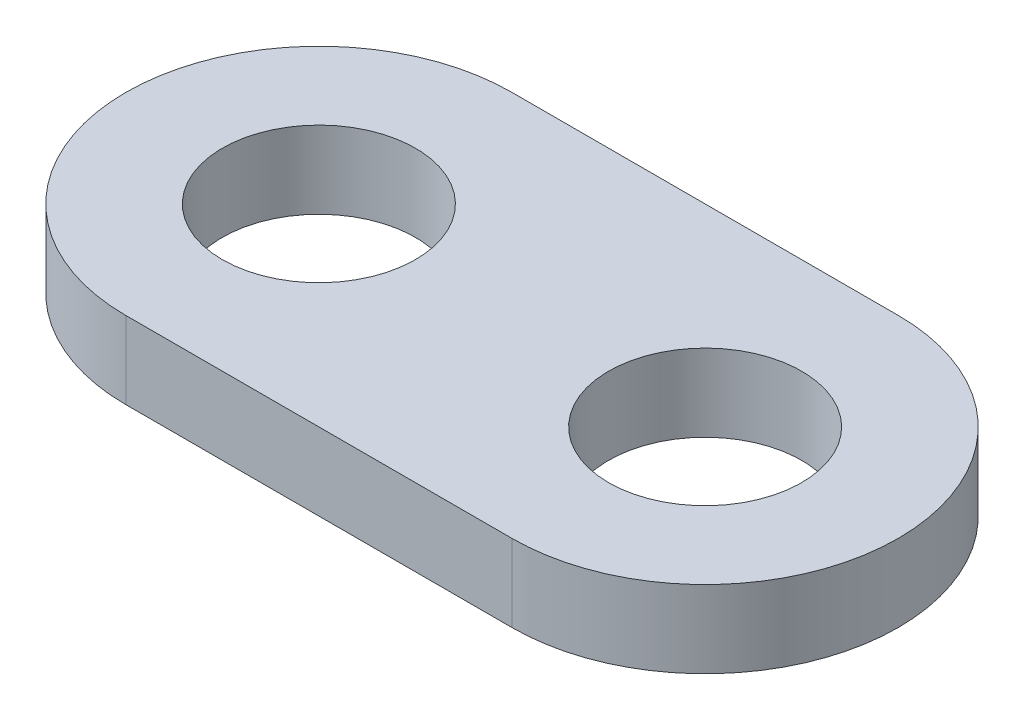
ISO-10303-21;
HEADER;
FILE_DESCRIPTION(('STEP AP214'),'2;1');
FILE_NAME('part.step','',(''),(''),'','','');
FILE_SCHEMA(('AUTOMOTIVE_DESIGN { 1 0 10303 214 1 1 1 1 }'));
ENDSEC;
DATA;
#1=APPLICATION_CONTEXT('core data for automotive mechanical design processes');
#2=APPLICATION_PROTOCOL_DEFINITION('international standard','automotive_design',2000,#1);
#3=PRODUCT_CONTEXT('',#1,'mechanical');
#4=PRODUCT('Part','Part','',(#3));
#5=PRODUCT_RELATED_PRODUCT_CATEGORY('part','',(#4));
#6=PRODUCT_DEFINITION_FORMATION('','',#4);
#7=PRODUCT_DEFINITION_CONTEXT('part definition',#1,'design');
#8=PRODUCT_DEFINITION('design','',#6,#7);
#9=PRODUCT_DEFINITION_SHAPE('','',#8);
#10=(LENGTH_UNIT() NAMED_UNIT(*) SI_UNIT(.MILLI.,.METRE.));
#11=(NAMED_UNIT(*) PLANE_ANGLE_UNIT() SI_UNIT($,.RADIAN.));
#12=(NAMED_UNIT(*) SI_UNIT($,.STERADIAN.) SOLID_ANGLE_UNIT());
#13=UNCERTAINTY_MEASURE_WITH_UNIT(LENGTH_MEASURE(1.E-05),#10,'distance_accuracy_value','');
#14=(GEOMETRIC_REPRESENTATION_CONTEXT(3) GLOBAL_UNCERTAINTY_ASSIGNED_CONTEXT((#13)) GLOBAL_UNIT_ASSIGNED_CONTEXT((#10,
#11,#12)) REPRESENTATION_CONTEXT('',''));
#15=CARTESIAN_POINT('',(0.,0.,0.));
#16=DIRECTION('',(0.,0.,1.));
#17=DIRECTION('',(1.,0.,0.));
#18=AXIS2_PLACEMENT_3D('',#15,#16,#17);
#19=CARTESIAN_POINT('',(-6.34999999999999,2.54,0.));
#20=DIRECTION('',(0.,-1.,0.));
#21=DIRECTION('',(0.,0.,-1.));
#22=AXIS2_PLACEMENT_3D('',#19,#20,#21);
#23=CYLINDRICAL_SURFACE('',#22,6.35);
#24=CARTESIAN_POINT('',(-6.34999999999999,0.,0.));
#25=DIRECTION('',(0.,1.,0.));
#26=DIRECTION('',(0.,0.,1.));
#27=AXIS2_PLACEMENT_3D('',#24,#25,#26);
#28=CIRCLE('',#27,6.35);
#29=CARTESIAN_POINT('',(-6.35,0.,-6.35));
#30=VERTEX_POINT('',#29);
#31=CARTESIAN_POINT('',(-6.35,0.,6.35));
#32=VERTEX_POINT('',#31);
#33=EDGE_CURVE('E111',#30,#32,#28,.T.);
#34=ORIENTED_EDGE('',*,*,#33,.T.);
#35=DIRECTION('',(0.,-1.,0.));
#36=VECTOR('',#35,1.);
#37=CARTESIAN_POINT('',(-6.35,2.54,6.35));
#38=LINE('',#37,#36);
#39=CARTESIAN_POINT('',(-6.35,2.54,6.35));
#40=VERTEX_POINT('',#39);
#41=EDGE_CURVE('E11',#40,#32,#38,.T.);
#42=ORIENTED_EDGE('',*,*,#41,.F.);
#43=CARTESIAN_POINT('',(-6.34999999999999,2.54,0.));
#44=DIRECTION('',(0.,1.,0.));
#45=DIRECTION('',(0.,0.,1.));
#46=AXIS2_PLACEMENT_3D('',#43,#44,#45);
#47=CIRCLE('',#46,6.35);
#48=CARTESIAN_POINT('',(-6.35,2.54,-6.35));
#49=VERTEX_POINT('',#48);
#50=EDGE_CURVE('E95',#49,#40,#47,.T.);
#51=ORIENTED_EDGE('',*,*,#50,.F.);
#52=DIRECTION('',(0.,-1.,0.));
#53=VECTOR('',#52,1.);
#54=CARTESIAN_POINT('',(-6.35,2.54,-6.35));
#55=LINE('',#54,#53);
#56=EDGE_CURVE('E107',#49,#30,#55,.T.);
#57=ORIENTED_EDGE('',*,*,#56,.T.);
#58=EDGE_LOOP('',(#34,#42,#51,#57));
#59=FACE_BOUND('',#58,.T.);
#60=ADVANCED_FACE('F43',(#59),#23,.T.);
#61=CARTESIAN_POINT('',(-6.35,2.54,6.35));
#62=DIRECTION('',(0.,0.,-1.));
#63=DIRECTION('',(-1.,0.,0.));
#64=AXIS2_PLACEMENT_3D('',#61,#62,#63);
#65=PLANE('',#64);
#66=DIRECTION('',(1.,0.,0.));
#67=VECTOR('',#66,1.);
#68=CARTESIAN_POINT('',(-6.35,0.,6.35));
#69=LINE('',#68,#67);
#70=CARTESIAN_POINT('',(6.35,0.,6.35));
#71=VERTEX_POINT('',#70);
#72=EDGE_CURVE('E100',#32,#71,#69,.T.);
#73=ORIENTED_EDGE('',*,*,#72,.T.);
#74=DIRECTION('',(0.,-1.,0.));
#75=VECTOR('',#74,1.);
#76=CARTESIAN_POINT('',(6.35,2.54,6.35));
#77=LINE('',#76,#75);
#78=CARTESIAN_POINT('',(6.35,2.54,6.35));
#79=VERTEX_POINT('',#78);
#80=EDGE_CURVE('E52',#79,#71,#77,.T.);
#81=ORIENTED_EDGE('',*,*,#80,.F.);
#82=DIRECTION('',(1.,0.,0.));
#83=VECTOR('',#82,1.);
#84=CARTESIAN_POINT('',(-6.35,2.54,6.35));
#85=LINE('',#84,#83);
#86=EDGE_CURVE('E90',#40,#79,#85,.T.);
#87=ORIENTED_EDGE('',*,*,#86,.F.);
#88=ORIENTED_EDGE('',*,*,#41,.T.);
#89=EDGE_LOOP('',(#73,#81,#87,#88));
#90=FACE_BOUND('',#89,.T.);
#91=ADVANCED_FACE('F99',(#90),#65,.F.);
#92=CARTESIAN_POINT('',(6.35,2.54,0.));
#93=DIRECTION('',(0.,-1.,0.));
#94=DIRECTION('',(0.,0.,-1.));
#95=AXIS2_PLACEMENT_3D('',#92,#93,#94);
#96=CYLINDRICAL_SURFACE('',#95,6.35);
#97=CARTESIAN_POINT('',(6.35,0.,0.));
#98=DIRECTION('',(0.,1.,0.));
#99=DIRECTION('',(0.,0.,-1.));
#100=AXIS2_PLACEMENT_3D('',#97,#98,#99);
#101=CIRCLE('',#100,6.35);
#102=CARTESIAN_POINT('',(6.35,0.,-6.35));
#103=VERTEX_POINT('',#102);
#104=EDGE_CURVE('E77',#71,#103,#101,.T.);
#105=ORIENTED_EDGE('',*,*,#104,.T.);
#106=DIRECTION('',(0.,-1.,0.));
#107=VECTOR('',#106,1.);
#108=CARTESIAN_POINT('',(6.35,2.54,-6.35));
#109=LINE('',#108,#107);
#110=CARTESIAN_POINT('',(6.35,2.54,-6.35));
#111=VERTEX_POINT('',#110);
#112=EDGE_CURVE('E102',#111,#103,#109,.T.);
#113=ORIENTED_EDGE('',*,*,#112,.F.);
#114=CARTESIAN_POINT('',(6.35,2.54,0.));
#115=DIRECTION('',(0.,1.,0.));
#116=DIRECTION('',(0.,0.,-1.));
#117=AXIS2_PLACEMENT_3D('',#114,#115,#116);
#118=CIRCLE('',#117,6.35);
#119=EDGE_CURVE('E93',#79,#111,#118,.T.);
#120=ORIENTED_EDGE('',*,*,#119,.F.);
#121=ORIENTED_EDGE('',*,*,#80,.T.);
#122=EDGE_LOOP('',(#105,#113,#120,#121));
#123=FACE_BOUND('',#122,.T.);
#124=ADVANCED_FACE('F103',(#123),#96,.T.);
#125=CARTESIAN_POINT('',(6.35,2.54,-6.35));
#126=DIRECTION('',(0.,0.,1.));
#127=DIRECTION('',(1.,0.,0.));
#128=AXIS2_PLACEMENT_3D('',#125,#126,#127);
#129=PLANE('',#128);
#130=DIRECTION('',(-1.,0.,0.));
#131=VECTOR('',#130,1.);
#132=CARTESIAN_POINT('',(6.35,0.,-6.35));
#133=LINE('',#132,#131);
#134=EDGE_CURVE('E83',#103,#30,#133,.T.);
#135=ORIENTED_EDGE('',*,*,#134,.T.);
#136=ORIENTED_EDGE('',*,*,#56,.F.);
#137=DIRECTION('',(-1.,0.,0.));
#138=VECTOR('',#137,1.);
#139=CARTESIAN_POINT('',(6.35,2.54,-6.35));
#140=LINE('',#139,#138);
#141=EDGE_CURVE('E60',#111,#49,#140,.T.);
#142=ORIENTED_EDGE('',*,*,#141,.F.);
#143=ORIENTED_EDGE('',*,*,#112,.T.);
#144=EDGE_LOOP('',(#135,#136,#142,#143));
#145=FACE_BOUND('',#144,.T.);
#146=ADVANCED_FACE('F125',(#145),#129,.F.);
#147=CARTESIAN_POINT('',(-6.34999999999999,2.54,0.));
#148=DIRECTION('',(0.,1.,0.));
#149=DIRECTION('',(0.,0.,1.));
#150=AXIS2_PLACEMENT_3D('',#147,#148,#149);
#151=PLANE('',#150);
#152=CARTESIAN_POINT('',(-6.34999999999999,2.54,0.));
#153=DIRECTION('',(0.,1.,0.));
#154=DIRECTION('',(0.,0.,1.));
#155=AXIS2_PLACEMENT_3D('',#152,#153,#154);
#156=CIRCLE('',#155,3.175);
#157=CARTESIAN_POINT('',(-6.34999999999999,2.54,3.175));
#158=VERTEX_POINT('',#157);
#159=EDGE_CURVE('E140',#158,#158,#156,.T.);
#160=ORIENTED_EDGE('',*,*,#159,.F.);
#161=EDGE_LOOP('',(#160));
#162=FACE_BOUND('',#161,.T.);
#163=CARTESIAN_POINT('',(6.35,2.54,0.));
#164=DIRECTION('',(0.,1.,0.));
#165=DIRECTION('',(0.,0.,1.));
#166=AXIS2_PLACEMENT_3D('',#163,#164,#165);
#167=CIRCLE('',#166,3.175);
#168=CARTESIAN_POINT('',(6.35,2.54,3.175));
#169=VERTEX_POINT('',#168);
#170=EDGE_CURVE('E136',#169,#169,#167,.T.);
#171=ORIENTED_EDGE('',*,*,#170,.F.);
#172=EDGE_LOOP('',(#171));
#173=FACE_BOUND('',#172,.T.);
#174=ORIENTED_EDGE('',*,*,#50,.T.);
#175=ORIENTED_EDGE('',*,*,#86,.T.);
#176=ORIENTED_EDGE('',*,*,#119,.T.);
#177=ORIENTED_EDGE('',*,*,#141,.T.);
#178=EDGE_LOOP('',(#174,#175,#176,#177));
#179=FACE_BOUND('',#178,.T.);
#180=ADVANCED_FACE('F91',(#162,#173,#179),#151,.T.);
#181=CARTESIAN_POINT('',(-6.34999999999999,0.,0.));
#182=DIRECTION('',(0.,1.,0.));
#183=DIRECTION('',(0.,0.,1.));
#184=AXIS2_PLACEMENT_3D('',#181,#182,#183);
#185=PLANE('',#184);
#186=CARTESIAN_POINT('',(-6.34999999999999,0.,0.));
#187=DIRECTION('',(0.,1.,0.));
#188=DIRECTION('',(0.,0.,1.));
#189=AXIS2_PLACEMENT_3D('',#186,#187,#188);
#190=CIRCLE('',#189,3.175);
#191=CARTESIAN_POINT('',(-6.34999999999999,0.,3.175));
#192=VERTEX_POINT('',#191);
#193=EDGE_CURVE('E115',#192,#192,#190,.T.);
#194=ORIENTED_EDGE('',*,*,#193,.T.);
#195=EDGE_LOOP('',(#194));
#196=FACE_BOUND('',#195,.T.);
#197=CARTESIAN_POINT('',(6.35,0.,0.));
#198=DIRECTION('',(0.,1.,0.));
#199=DIRECTION('',(0.,0.,1.));
#200=AXIS2_PLACEMENT_3D('',#197,#198,#199);
#201=CIRCLE('',#200,3.175);
#202=CARTESIAN_POINT('',(6.35,0.,3.175));
#203=VERTEX_POINT('',#202);
#204=EDGE_CURVE('E132',#203,#203,#201,.T.);
#205=ORIENTED_EDGE('',*,*,#204,.T.);
#206=EDGE_LOOP('',(#205));
#207=FACE_BOUND('',#206,.T.);
#208=ORIENTED_EDGE('',*,*,#33,.F.);
#209=ORIENTED_EDGE('',*,*,#134,.F.);
#210=ORIENTED_EDGE('',*,*,#104,.F.);
#211=ORIENTED_EDGE('',*,*,#72,.F.);
#212=EDGE_LOOP('',(#208,#209,#210,#211));
#213=FACE_BOUND('',#212,.T.);
#214=ADVANCED_FACE('F128',(#196,#207,#213),#185,.F.);
#215=CARTESIAN_POINT('',(6.35,0.,0.));
#216=DIRECTION('',(0.,1.,0.));
#217=DIRECTION('',(0.,0.,1.));
#218=AXIS2_PLACEMENT_3D('',#215,#216,#217);
#219=CYLINDRICAL_SURFACE('',#218,3.175);
#220=ORIENTED_EDGE('',*,*,#204,.F.);
#221=EDGE_LOOP('',(#220));
#222=FACE_BOUND('',#221,.T.);
#223=ORIENTED_EDGE('',*,*,#170,.T.);
#224=EDGE_LOOP('',(#223));
#225=FACE_BOUND('',#224,.T.);
#226=ADVANCED_FACE('F153',(#222,#225),#219,.F.);
#227=CARTESIAN_POINT('',(-6.34999999999999,0.,0.));
#228=DIRECTION('',(0.,1.,0.));
#229=DIRECTION('',(0.,0.,1.));
#230=AXIS2_PLACEMENT_3D('',#227,#228,#229);
#231=CYLINDRICAL_SURFACE('',#230,3.175);
#232=ORIENTED_EDGE('',*,*,#193,.F.);
#233=EDGE_LOOP('',(#232));
#234=FACE_BOUND('',#233,.T.);
#235=ORIENTED_EDGE('',*,*,#159,.T.);
#236=EDGE_LOOP('',(#235));
#237=FACE_BOUND('',#236,.T.);
#238=ADVANCED_FACE('F150',(#234,#237),#231,.F.);
#239=CLOSED_SHELL('',(#60,#91,#124,#146,#180,#214,#226,#238));
#240=MANIFOLD_SOLID_BREP('B2',#239);
#241=ADVANCED_BREP_SHAPE_REPRESENTATION('',(#18,#240),#14);
#242=SHAPE_DEFINITION_REPRESENTATION(#9,#241);
ENDSEC;
END-ISO-10303-21;
